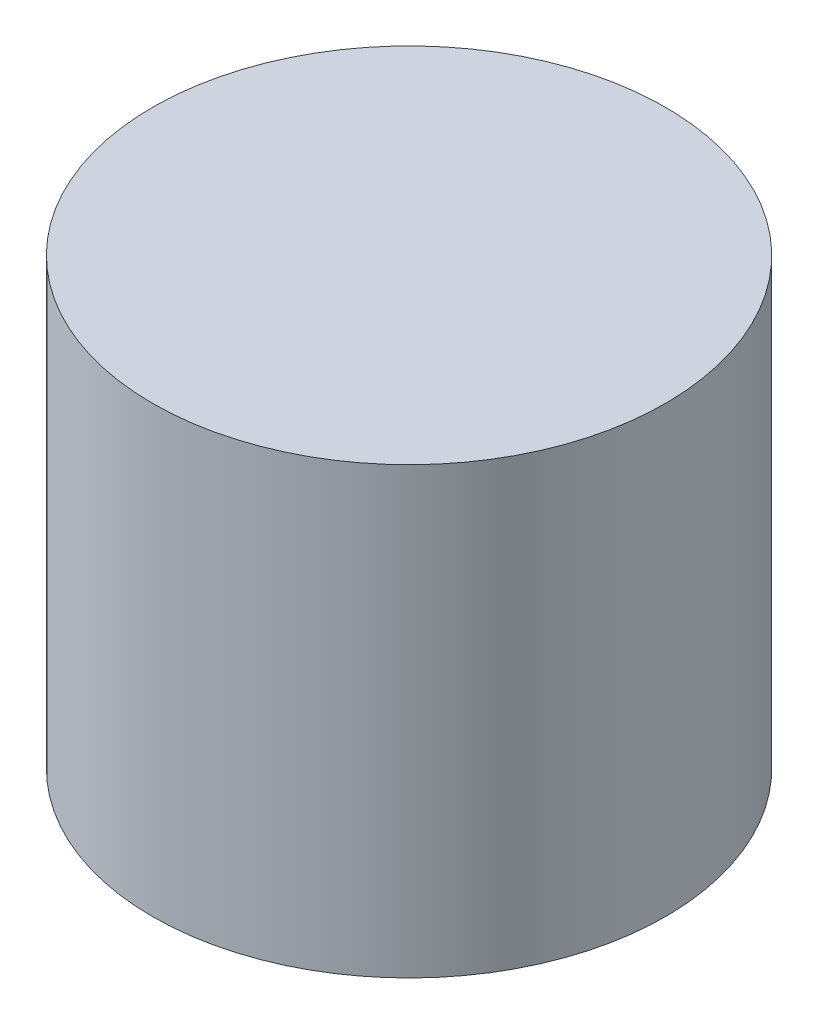
ISO-10303-21;
HEADER;
FILE_DESCRIPTION(('STEP AP214'),'2;1');
FILE_NAME('part.step','',(''),(''),'','','');
FILE_SCHEMA(('AUTOMOTIVE_DESIGN { 1 0 10303 214 1 1 1 1 }'));
ENDSEC;
DATA;
#1=APPLICATION_CONTEXT('core data for automotive mechanical design processes');
#2=APPLICATION_PROTOCOL_DEFINITION('international standard','automotive_design',2000,#1);
#3=PRODUCT_CONTEXT('',#1,'mechanical');
#4=PRODUCT('Part','Part','',(#3));
#5=PRODUCT_RELATED_PRODUCT_CATEGORY('part','',(#4));
#6=PRODUCT_DEFINITION_FORMATION('','',#4);
#7=PRODUCT_DEFINITION_CONTEXT('part definition',#1,'design');
#8=PRODUCT_DEFINITION('design','',#6,#7);
#9=PRODUCT_DEFINITION_SHAPE('','',#8);
#10=(LENGTH_UNIT() NAMED_UNIT(*) SI_UNIT(.MILLI.,.METRE.));
#11=(NAMED_UNIT(*) PLANE_ANGLE_UNIT() SI_UNIT($,.RADIAN.));
#12=(NAMED_UNIT(*) SI_UNIT($,.STERADIAN.) SOLID_ANGLE_UNIT());
#13=UNCERTAINTY_MEASURE_WITH_UNIT(LENGTH_MEASURE(1.E-05),#10,'distance_accuracy_value','');
#14=(GEOMETRIC_REPRESENTATION_CONTEXT(3) GLOBAL_UNCERTAINTY_ASSIGNED_CONTEXT((#13)) GLOBAL_UNIT_ASSIGNED_CONTEXT((#10,
#11,#12)) REPRESENTATION_CONTEXT('',''));
#15=CARTESIAN_POINT('',(0.,0.,0.));
#16=DIRECTION('',(0.,0.,1.));
#17=DIRECTION('',(1.,0.,0.));
#18=AXIS2_PLACEMENT_3D('',#15,#16,#17);
#19=CARTESIAN_POINT('',(0.,130.,0.));
#20=DIRECTION('',(0.,-1.,0.));
#21=DIRECTION('',(0.,0.,-1.));
#22=AXIS2_PLACEMENT_3D('',#19,#20,#21);
#23=CYLINDRICAL_SURFACE('',#22,75.);
#24=CARTESIAN_POINT('',(0.,130.,0.));
#25=DIRECTION('',(0.,1.,0.));
#26=DIRECTION('',(0.,0.,1.));
#27=AXIS2_PLACEMENT_3D('',#24,#25,#26);
#28=CIRCLE('',#27,75.);
#29=CARTESIAN_POINT('',(0.,130.,75.));
#30=VERTEX_POINT('',#29);
#31=EDGE_CURVE('E10',#30,#30,#28,.T.);
#32=ORIENTED_EDGE('',*,*,#31,.F.);
#33=EDGE_LOOP('',(#32));
#34=FACE_BOUND('',#33,.T.);
#35=CARTESIAN_POINT('',(0.,0.,0.));
#36=DIRECTION('',(0.,1.,0.));
#37=DIRECTION('',(0.,0.,1.));
#38=AXIS2_PLACEMENT_3D('',#35,#36,#37);
#39=CIRCLE('',#38,75.);
#40=CARTESIAN_POINT('',(0.,0.,75.));
#41=VERTEX_POINT('',#40);
#42=EDGE_CURVE('E38',#41,#41,#39,.T.);
#43=ORIENTED_EDGE('',*,*,#42,.T.);
#44=EDGE_LOOP('',(#43));
#45=FACE_BOUND('',#44,.T.);
#46=ADVANCED_FACE('F35',(#34,#45),#23,.T.);
#47=CARTESIAN_POINT('',(0.,130.,0.));
#48=DIRECTION('',(0.,1.,0.));
#49=DIRECTION('',(0.,0.,1.));
#50=AXIS2_PLACEMENT_3D('',#47,#48,#49);
#51=PLANE('',#50);
#52=ORIENTED_EDGE('',*,*,#31,.T.);
#53=EDGE_LOOP('',(#52));
#54=FACE_BOUND('',#53,.T.);
#55=ADVANCED_FACE('F50',(#54),#51,.T.);
#56=CARTESIAN_POINT('',(0.,0.,0.));
#57=DIRECTION('',(0.,1.,0.));
#58=DIRECTION('',(0.,0.,1.));
#59=AXIS2_PLACEMENT_3D('',#56,#57,#58);
#60=PLANE('',#59);
#61=ORIENTED_EDGE('',*,*,#42,.F.);
#62=EDGE_LOOP('',(#61));
#63=FACE_BOUND('',#62,.T.);
#64=ADVANCED_FACE('F48',(#63),#60,.F.);
#65=CLOSED_SHELL('',(#46,#55,#64));
#66=MANIFOLD_SOLID_BREP('B2',#65);
#67=ADVANCED_BREP_SHAPE_REPRESENTATION('',(#18,#66),#14);
#68=SHAPE_DEFINITION_REPRESENTATION(#9,#67);
ENDSEC;
END-ISO-10303-21;
